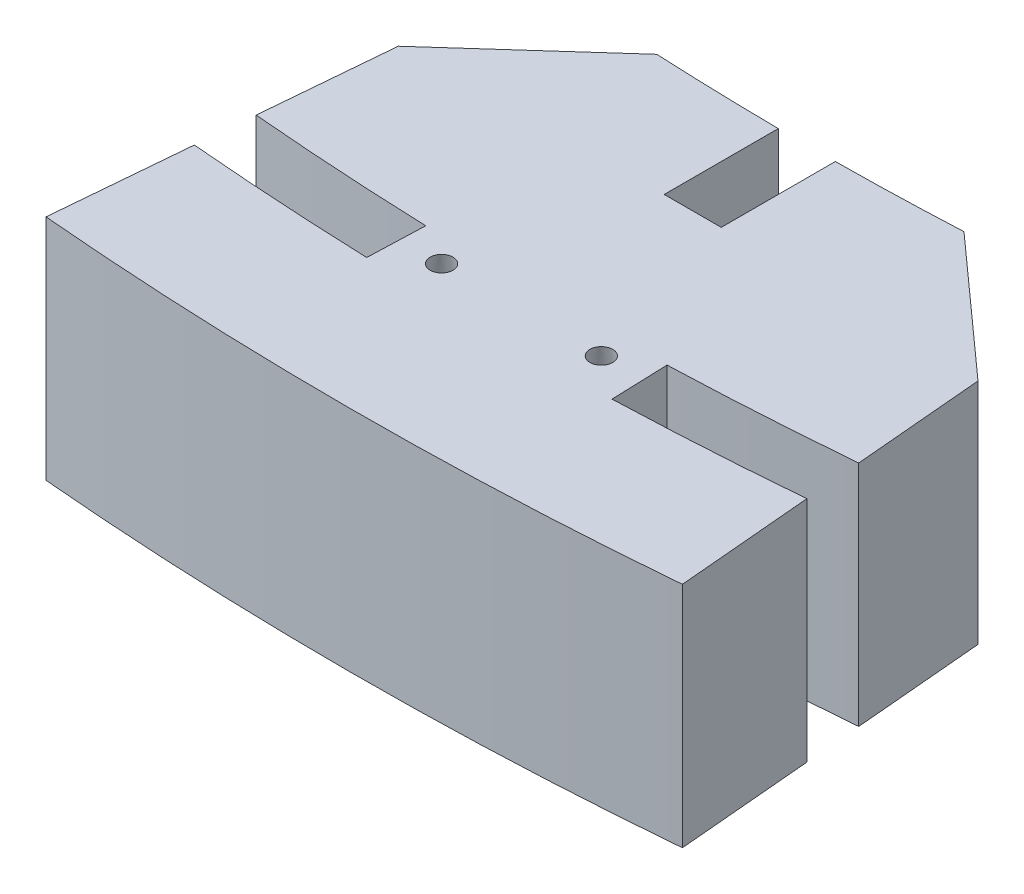
ISO-10303-21;
HEADER;
FILE_DESCRIPTION(('STEP AP214'),'2;1');
FILE_NAME('part.step','',(''),(''),'','','');
FILE_SCHEMA(('AUTOMOTIVE_DESIGN { 1 0 10303 214 1 1 1 1 }'));
ENDSEC;
DATA;
#1=APPLICATION_CONTEXT('core data for automotive mechanical design processes');
#2=APPLICATION_PROTOCOL_DEFINITION('international standard','automotive_design',2000,#1);
#3=PRODUCT_CONTEXT('',#1,'mechanical');
#4=PRODUCT('Part','Part','',(#3));
#5=PRODUCT_RELATED_PRODUCT_CATEGORY('part','',(#4));
#6=PRODUCT_DEFINITION_FORMATION('','',#4);
#7=PRODUCT_DEFINITION_CONTEXT('part definition',#1,'design');
#8=PRODUCT_DEFINITION('design','',#6,#7);
#9=PRODUCT_DEFINITION_SHAPE('','',#8);
#10=(LENGTH_UNIT() NAMED_UNIT(*) SI_UNIT(.MILLI.,.METRE.));
#11=(NAMED_UNIT(*) PLANE_ANGLE_UNIT() SI_UNIT($,.RADIAN.));
#12=(NAMED_UNIT(*) SI_UNIT($,.STERADIAN.) SOLID_ANGLE_UNIT());
#13=UNCERTAINTY_MEASURE_WITH_UNIT(LENGTH_MEASURE(1.E-05),#10,'distance_accuracy_value','');
#14=(GEOMETRIC_REPRESENTATION_CONTEXT(3) GLOBAL_UNCERTAINTY_ASSIGNED_CONTEXT((#13)) GLOBAL_UNIT_ASSIGNED_CONTEXT((#10,
#11,#12)) REPRESENTATION_CONTEXT('',''));
#15=CARTESIAN_POINT('',(0.,0.,0.));
#16=DIRECTION('',(0.,0.,1.));
#17=DIRECTION('',(1.,0.,0.));
#18=AXIS2_PLACEMENT_3D('',#15,#16,#17);
#19=CARTESIAN_POINT('',(53.7452249218411,100.,1539.06187360941));
#20=DIRECTION('',(-0.999390827019096,0.,0.0348994967024942));
#21=DIRECTION('',(0.0348994967024942,0.,0.999390827019096));
#22=AXIS2_PLACEMENT_3D('',#19,#20,#21);
#23=PLANE('',#22);
#24=DIRECTION('',(-0.0348994967024942,0.,-0.999390827019096));
#25=VECTOR('',#24,1.);
#26=CARTESIAN_POINT('',(53.7452249218411,0.,1539.06187360941));
#27=LINE('',#26,#25);
#28=CARTESIAN_POINT('',(53.7452249218411,0.,1539.06187360941));
#29=VERTEX_POINT('',#28);
#30=CARTESIAN_POINT('',(52.8727375042787,0.,1514.07710293393));
#31=VERTEX_POINT('',#30);
#32=EDGE_CURVE('E229',#29,#31,#27,.T.);
#33=ORIENTED_EDGE('',*,*,#32,.T.);
#34=DIRECTION('',(0.,-1.,0.));
#35=VECTOR('',#34,1.);
#36=CARTESIAN_POINT('',(52.8727375042787,100.,1514.07710293393));
#37=LINE('',#36,#35);
#38=CARTESIAN_POINT('',(52.8727375042787,100.,1514.07710293393));
#39=VERTEX_POINT('',#38);
#40=EDGE_CURVE('E251',#39,#31,#37,.T.);
#41=ORIENTED_EDGE('',*,*,#40,.F.);
#42=DIRECTION('',(-0.0348994967024942,0.,-0.999390827019096));
#43=VECTOR('',#42,1.);
#44=CARTESIAN_POINT('',(53.7452249218411,100.,1539.06187360941));
#45=LINE('',#44,#43);
#46=CARTESIAN_POINT('',(53.7452249218411,100.,1539.06187360941));
#47=VERTEX_POINT('',#46);
#48=EDGE_CURVE('E414',#47,#39,#45,.T.);
#49=ORIENTED_EDGE('',*,*,#48,.F.);
#50=DIRECTION('',(0.,-1.,0.));
#51=VECTOR('',#50,1.);
#52=CARTESIAN_POINT('',(53.7452249218411,100.,1539.06187360941));
#53=LINE('',#52,#51);
#54=EDGE_CURVE('E253',#47,#29,#53,.T.);
#55=ORIENTED_EDGE('',*,*,#54,.T.);
#56=EDGE_LOOP('',(#33,#41,#49,#55));
#57=FACE_BOUND('',#56,.T.);
#58=CARTESIAN_POINT('',(53.274081716357,40.,1525.57009744465));
#59=DIRECTION('',(0.999390827019096,0.,-0.034899496702494));
#60=DIRECTION('',(-0.034899496702494,0.,-0.999390827019096));
#61=AXIS2_PLACEMENT_3D('',#58,#59,#60);
#62=CIRCLE('',#61,2.49999999999999);
#63=CARTESIAN_POINT('',(53.1868329746008,40.,1523.0716203771));
#64=VERTEX_POINT('',#63);
#65=EDGE_CURVE('E167',#64,#64,#62,.T.);
#66=ORIENTED_EDGE('',*,*,#65,.F.);
#67=EDGE_LOOP('',(#66));
#68=FACE_BOUND('',#67,.T.);
#69=ADVANCED_FACE('F37',(#57,#68),#23,.F.);
#70=CARTESIAN_POINT('',(-139.449188396242,100.,1593.91151694679));
#71=DIRECTION('',(0.996194698091746,0.,0.0871557427476512));
#72=DIRECTION('',(0.0871557427476512,0.,-0.996194698091746));
#73=AXIS2_PLACEMENT_3D('',#70,#71,#72);
#74=PLANE('',#73);
#75=DIRECTION('',(-0.0871557427476512,0.,0.996194698091746));
#76=VECTOR('',#75,1.);
#77=CARTESIAN_POINT('',(-139.449188396242,100.,1593.91151694679));
#78=LINE('',#77,#76);
#79=CARTESIAN_POINT('',(-127.029495054575,100.,1451.95377246873));
#80=VERTEX_POINT('',#79);
#81=CARTESIAN_POINT('',(-132.040950262692,100.,1509.234967609));
#82=VERTEX_POINT('',#81);
#83=EDGE_CURVE('E196',#80,#82,#78,.T.);
#84=ORIENTED_EDGE('',*,*,#83,.F.);
#85=DIRECTION('',(0.,-1.,0.));
#86=VECTOR('',#85,1.);
#87=CARTESIAN_POINT('',(-127.029495054575,100.001,1451.95377246873));
#88=LINE('',#87,#86);
#89=CARTESIAN_POINT('',(-127.029495054575,0.,1451.95377246873));
#90=VERTEX_POINT('',#89);
#91=EDGE_CURVE('E163',#80,#90,#88,.T.);
#92=ORIENTED_EDGE('',*,*,#91,.T.);
#93=DIRECTION('',(-0.0871557427476512,0.,0.996194698091746));
#94=VECTOR('',#93,1.);
#95=CARTESIAN_POINT('',(-139.449188396242,0.,1593.91151694679));
#96=LINE('',#95,#94);
#97=CARTESIAN_POINT('',(-132.040950262692,0.,1509.234967609));
#98=VERTEX_POINT('',#97);
#99=EDGE_CURVE('E207',#90,#98,#96,.T.);
#100=ORIENTED_EDGE('',*,*,#99,.T.);
#101=DIRECTION('',(0.,-1.,0.));
#102=VECTOR('',#101,1.);
#103=CARTESIAN_POINT('',(-132.040950262692,100.,1509.234967609));
#104=LINE('',#103,#102);
#105=EDGE_CURVE('E259',#82,#98,#104,.T.);
#106=ORIENTED_EDGE('',*,*,#105,.F.);
#107=EDGE_LOOP('',(#84,#92,#100,#106));
#108=FACE_BOUND('',#107,.T.);
#109=ADVANCED_FACE('F328',(#108),#74,.F.);
#110=CARTESIAN_POINT('',(122.018039846722,100.,1394.67257732844));
#111=DIRECTION('',(-0.996194698091746,0.,0.0871557427476584));
#112=DIRECTION('',(0.0871557427476584,0.,0.996194698091746));
#113=AXIS2_PLACEMENT_3D('',#110,#111,#112);
#114=PLANE('',#113);
#115=DIRECTION('',(-0.0871557427476584,0.,-0.996194698091746));
#116=VECTOR('',#115,1.);
#117=CARTESIAN_POINT('',(122.018039846722,0.,1394.67257732844));
#118=LINE('',#117,#116);
#119=CARTESIAN_POINT('',(139.449188396253,0.,1593.91151694679));
#120=VERTEX_POINT('',#119);
#121=CARTESIAN_POINT('',(134.219843831383,0.,1534.13983506129));
#122=VERTEX_POINT('',#121);
#123=EDGE_CURVE('E186',#120,#122,#118,.T.);
#124=ORIENTED_EDGE('',*,*,#123,.T.);
#125=DIRECTION('',(0.,-1.,0.));
#126=VECTOR('',#125,1.);
#127=CARTESIAN_POINT('',(134.219843831383,100.,1534.13983506129));
#128=LINE('',#127,#126);
#129=CARTESIAN_POINT('',(134.219843831383,100.,1534.13983506129));
#130=VERTEX_POINT('',#129);
#131=EDGE_CURVE('E245',#130,#122,#128,.T.);
#132=ORIENTED_EDGE('',*,*,#131,.F.);
#133=DIRECTION('',(-0.0871557427476584,0.,-0.996194698091746));
#134=VECTOR('',#133,1.);
#135=CARTESIAN_POINT('',(122.018039846722,100.,1394.67257732844));
#136=LINE('',#135,#134);
#137=CARTESIAN_POINT('',(139.449188396253,100.,1593.91151694679));
#138=VERTEX_POINT('',#137);
#139=EDGE_CURVE('E201',#138,#130,#136,.T.);
#140=ORIENTED_EDGE('',*,*,#139,.F.);
#141=DIRECTION('',(0.,-1.,0.));
#142=VECTOR('',#141,1.);
#143=CARTESIAN_POINT('',(139.449188396253,100.,1593.91151694679));
#144=LINE('',#143,#142);
#145=EDGE_CURVE('E45',#138,#120,#144,.T.);
#146=ORIENTED_EDGE('',*,*,#145,.T.);
#147=EDGE_LOOP('',(#124,#132,#140,#146));
#148=FACE_BOUND('',#147,.T.);
#149=ADVANCED_FACE('F215',(#148),#114,.F.);
#150=CARTESIAN_POINT('',(0.,100.,0.));
#151=DIRECTION('',(0.,-1.,0.));
#152=DIRECTION('',(0.,0.,-1.));
#153=AXIS2_PLACEMENT_3D('',#150,#151,#152);
#154=CYLINDRICAL_SURFACE('',#153,1400.);
#155=CARTESIAN_POINT('',(0.,0.,0.));
#156=DIRECTION('',(0.,-1.,0.));
#157=DIRECTION('',(0.,0.,1.));
#158=AXIS2_PLACEMENT_3D('',#155,#156,#157);
#159=CIRCLE('',#158,1400.);
#160=CARTESIAN_POINT('',(-12.4999999999998,0.,1399.94419531637));
#161=VERTEX_POINT('',#160);
#162=CARTESIAN_POINT('',(-67.3106473754612,0.,1398.38094836489));
#163=VERTEX_POINT('',#162);
#164=EDGE_CURVE('E176',#161,#163,#159,.T.);
#165=ORIENTED_EDGE('',*,*,#164,.T.);
#166=DIRECTION('',(0.,-1.,0.));
#167=VECTOR('',#166,1.);
#168=CARTESIAN_POINT('',(-67.3106473754612,100.001,1398.38094836489));
#169=LINE('',#168,#167);
#170=CARTESIAN_POINT('',(-67.3106473754614,100.,1398.38094836489));
#171=VERTEX_POINT('',#170);
#172=EDGE_CURVE('E60',#171,#163,#169,.T.);
#173=ORIENTED_EDGE('',*,*,#172,.F.);
#174=CARTESIAN_POINT('',(0.,100.,0.));
#175=DIRECTION('',(0.,-1.,0.));
#176=DIRECTION('',(0.,0.,1.));
#177=AXIS2_PLACEMENT_3D('',#174,#175,#176);
#178=CIRCLE('',#177,1400.);
#179=CARTESIAN_POINT('',(-12.4999999999998,100.,1399.94419531637));
#180=VERTEX_POINT('',#179);
#181=EDGE_CURVE('E174',#180,#171,#178,.T.);
#182=ORIENTED_EDGE('',*,*,#181,.F.);
#183=DIRECTION('',(0.,1.,0.));
#184=VECTOR('',#183,1.);
#185=CARTESIAN_POINT('',(-12.4999999999998,0.,1399.94419531637));
#186=LINE('',#185,#184);
#187=EDGE_CURVE('E292',#161,#180,#186,.T.);
#188=ORIENTED_EDGE('',*,*,#187,.F.);
#189=EDGE_LOOP('',(#165,#173,#182,#188));
#190=FACE_BOUND('',#189,.T.);
#191=ADVANCED_FACE('F172',(#190),#154,.F.);
#192=CARTESIAN_POINT('',(67.3106473754616,100.,1398.38094836489));
#193=VERTEX_POINT('',#192);
#194=CARTESIAN_POINT('',(12.5000000000002,100.,1399.94419531637));
#195=VERTEX_POINT('',#194);
#196=EDGE_CURVE('E185',#193,#195,#178,.T.);
#197=ORIENTED_EDGE('',*,*,#196,.F.);
#198=DIRECTION('',(0.,-1.,0.));
#199=VECTOR('',#198,1.);
#200=CARTESIAN_POINT('',(67.3106473754616,100.001,1398.38094836489));
#201=LINE('',#200,#199);
#202=CARTESIAN_POINT('',(67.3106473754616,0.,1398.38094836489));
#203=VERTEX_POINT('',#202);
#204=EDGE_CURVE('E309',#193,#203,#201,.T.);
#205=ORIENTED_EDGE('',*,*,#204,.T.);
#206=CARTESIAN_POINT('',(12.5000000000002,0.,1399.94419531637));
#207=VERTEX_POINT('',#206);
#208=EDGE_CURVE('E204',#203,#207,#159,.T.);
#209=ORIENTED_EDGE('',*,*,#208,.T.);
#210=DIRECTION('',(0.,1.,0.));
#211=VECTOR('',#210,1.);
#212=CARTESIAN_POINT('',(12.5000000000002,0.,1399.94419531637));
#213=LINE('',#212,#211);
#214=EDGE_CURVE('E293',#207,#195,#213,.T.);
#215=ORIENTED_EDGE('',*,*,#214,.T.);
#216=EDGE_LOOP('',(#197,#205,#209,#215));
#217=FACE_BOUND('',#216,.T.);
#218=ADVANCED_FACE('F39',(#217),#154,.F.);
#219=CARTESIAN_POINT('',(-134.219843831383,100.,1534.13983506129));
#220=VERTEX_POINT('',#219);
#221=CARTESIAN_POINT('',(-139.449188396242,100.,1593.91151694679));
#222=VERTEX_POINT('',#221);
#223=EDGE_CURVE('E188',#220,#222,#78,.T.);
#224=ORIENTED_EDGE('',*,*,#223,.F.);
#225=DIRECTION('',(0.,-1.,0.));
#226=VECTOR('',#225,1.);
#227=CARTESIAN_POINT('',(-134.219843831383,100.,1534.13983506129));
#228=LINE('',#227,#226);
#229=CARTESIAN_POINT('',(-134.219843831383,0.,1534.13983506129));
#230=VERTEX_POINT('',#229);
#231=EDGE_CURVE('E385',#220,#230,#228,.T.);
#232=ORIENTED_EDGE('',*,*,#231,.T.);
#233=CARTESIAN_POINT('',(-139.449188396242,0.,1593.91151694679));
#234=VERTEX_POINT('',#233);
#235=EDGE_CURVE('E206',#230,#234,#96,.T.);
#236=ORIENTED_EDGE('',*,*,#235,.T.);
#237=DIRECTION('',(0.,-1.,0.));
#238=VECTOR('',#237,1.);
#239=CARTESIAN_POINT('',(-139.449188396242,100.,1593.91151694679));
#240=LINE('',#239,#238);
#241=EDGE_CURVE('E11',#222,#234,#240,.T.);
#242=ORIENTED_EDGE('',*,*,#241,.F.);
#243=EDGE_LOOP('',(#224,#232,#236,#242));
#244=FACE_BOUND('',#243,.T.);
#245=ADVANCED_FACE('F335',(#244),#74,.F.);
#246=CARTESIAN_POINT('',(0.,100.,0.));
#247=DIRECTION('',(0.,-1.,0.));
#248=DIRECTION('',(0.,0.,-1.));
#249=AXIS2_PLACEMENT_3D('',#246,#247,#248);
#250=CYLINDRICAL_SURFACE('',#249,1600.);
#251=CARTESIAN_POINT('',(0.,0.,0.));
#252=DIRECTION('',(0.,1.,0.));
#253=DIRECTION('',(0.,0.,1.));
#254=AXIS2_PLACEMENT_3D('',#251,#252,#253);
#255=CIRCLE('',#254,1600.);
#256=EDGE_CURVE('E209',#234,#120,#255,.T.);
#257=ORIENTED_EDGE('',*,*,#256,.T.);
#258=ORIENTED_EDGE('',*,*,#145,.F.);
#259=CARTESIAN_POINT('',(0.,100.,0.));
#260=DIRECTION('',(0.,1.,0.));
#261=DIRECTION('',(0.,0.,1.));
#262=AXIS2_PLACEMENT_3D('',#259,#260,#261);
#263=CIRCLE('',#262,1600.);
#264=EDGE_CURVE('E198',#222,#138,#263,.T.);
#265=ORIENTED_EDGE('',*,*,#264,.F.);
#266=ORIENTED_EDGE('',*,*,#241,.T.);
#267=EDGE_LOOP('',(#257,#258,#265,#266));
#268=FACE_BOUND('',#267,.T.);
#269=ADVANCED_FACE('F372',(#268),#250,.T.);
#270=CARTESIAN_POINT('',(132.040950262692,0.,1509.234967609));
#271=VERTEX_POINT('',#270);
#272=CARTESIAN_POINT('',(127.029495054725,0.,1451.95377246887));
#273=VERTEX_POINT('',#272);
#274=EDGE_CURVE('E190',#271,#273,#118,.T.);
#275=ORIENTED_EDGE('',*,*,#274,.T.);
#276=DIRECTION('',(0.,-1.,0.));
#277=VECTOR('',#276,1.);
#278=CARTESIAN_POINT('',(127.029495054575,100.001,1451.95377246873));
#279=LINE('',#278,#277);
#280=CARTESIAN_POINT('',(127.029495054725,100.,1451.95377246887));
#281=VERTEX_POINT('',#280);
#282=EDGE_CURVE('E52',#281,#273,#279,.T.);
#283=ORIENTED_EDGE('',*,*,#282,.F.);
#284=CARTESIAN_POINT('',(132.040950262692,100.,1509.234967609));
#285=VERTEX_POINT('',#284);
#286=EDGE_CURVE('E200',#285,#281,#136,.T.);
#287=ORIENTED_EDGE('',*,*,#286,.F.);
#288=DIRECTION('',(0.,-1.,0.));
#289=VECTOR('',#288,1.);
#290=CARTESIAN_POINT('',(132.040950262692,100.,1509.234967609));
#291=LINE('',#290,#289);
#292=EDGE_CURVE('E248',#285,#271,#291,.T.);
#293=ORIENTED_EDGE('',*,*,#292,.T.);
#294=EDGE_LOOP('',(#275,#283,#287,#293));
#295=FACE_BOUND('',#294,.T.);
#296=ADVANCED_FACE('F367',(#295),#114,.F.);
#297=CARTESIAN_POINT('',(0.,100.,0.));
#298=DIRECTION('',(0.,1.,0.));
#299=DIRECTION('',(0.,0.,1.));
#300=AXIS2_PLACEMENT_3D('',#297,#298,#299);
#301=PLANE('',#300);
#302=DIRECTION('',(-0.744372469430462,0.,0.667764649224558));
#303=VECTOR('',#302,1.);
#304=CARTESIAN_POINT('',(-127.029495054575,100.,1451.95377246873));
#305=LINE('',#304,#303);
#306=EDGE_CURVE('E160',#171,#80,#305,.T.);
#307=ORIENTED_EDGE('',*,*,#306,.T.);
#308=ORIENTED_EDGE('',*,*,#83,.T.);
#309=CARTESIAN_POINT('',(0.,100.,0.));
#310=DIRECTION('',(0.,1.,0.));
#311=DIRECTION('',(0.,0.,-1.));
#312=AXIS2_PLACEMENT_3D('',#309,#310,#311);
#313=CIRCLE('',#312,1515.);
#314=CARTESIAN_POINT('',(-52.8727375042787,100.,1514.07710293393));
#315=VERTEX_POINT('',#314);
#316=EDGE_CURVE('E399',#82,#315,#313,.T.);
#317=ORIENTED_EDGE('',*,*,#316,.T.);
#318=DIRECTION('',(-0.0348994967024942,0.,0.999390827019096));
#319=VECTOR('',#318,1.);
#320=CARTESIAN_POINT('',(-53.7452249218411,100.,1539.06187360941));
#321=LINE('',#320,#319);
#322=CARTESIAN_POINT('',(-53.7452249218411,100.,1539.06187360941));
#323=VERTEX_POINT('',#322);
#324=EDGE_CURVE('E392',#315,#323,#321,.T.);
#325=ORIENTED_EDGE('',*,*,#324,.T.);
#326=CARTESIAN_POINT('',(0.,100.,0.));
#327=DIRECTION('',(0.,-1.,0.));
#328=DIRECTION('',(0.,0.,-1.));
#329=AXIS2_PLACEMENT_3D('',#326,#327,#328);
#330=CIRCLE('',#329,1540.);
#331=EDGE_CURVE('E389',#323,#220,#330,.T.);
#332=ORIENTED_EDGE('',*,*,#331,.T.);
#333=ORIENTED_EDGE('',*,*,#223,.T.);
#334=ORIENTED_EDGE('',*,*,#264,.T.);
#335=ORIENTED_EDGE('',*,*,#139,.T.);
#336=CARTESIAN_POINT('',(0.,100.,0.));
#337=DIRECTION('',(0.,-1.,0.));
#338=DIRECTION('',(0.,0.,1.));
#339=AXIS2_PLACEMENT_3D('',#336,#337,#338);
#340=CIRCLE('',#339,1540.);
#341=EDGE_CURVE('E244',#130,#47,#340,.T.);
#342=ORIENTED_EDGE('',*,*,#341,.T.);
#343=ORIENTED_EDGE('',*,*,#48,.T.);
#344=CARTESIAN_POINT('',(0.,100.,0.));
#345=DIRECTION('',(0.,1.,0.));
#346=DIRECTION('',(0.,0.,1.));
#347=AXIS2_PLACEMENT_3D('',#344,#345,#346);
#348=CIRCLE('',#347,1515.);
#349=EDGE_CURVE('E240',#39,#285,#348,.T.);
#350=ORIENTED_EDGE('',*,*,#349,.T.);
#351=ORIENTED_EDGE('',*,*,#286,.T.);
#352=DIRECTION('',(-0.744372469430461,0.,-0.667764649224559));
#353=VECTOR('',#352,1.);
#354=CARTESIAN_POINT('',(127.029495054575,100.,1451.95377246873));
#355=LINE('',#354,#353);
#356=EDGE_CURVE('E307',#281,#193,#355,.T.);
#357=ORIENTED_EDGE('',*,*,#356,.T.);
#358=ORIENTED_EDGE('',*,*,#196,.T.);
#359=DIRECTION('',(0.,0.,-1.));
#360=VECTOR('',#359,1.);
#361=CARTESIAN_POINT('',(12.5000000000002,100.,1449.94419531637));
#362=LINE('',#361,#360);
#363=CARTESIAN_POINT('',(12.5000000000002,100.,1449.94419531637));
#364=VERTEX_POINT('',#363);
#365=EDGE_CURVE('E286',#364,#195,#362,.T.);
#366=ORIENTED_EDGE('',*,*,#365,.F.);
#367=DIRECTION('',(1.,0.,0.));
#368=VECTOR('',#367,1.);
#369=CARTESIAN_POINT('',(1.78676518025611E-13,100.,1449.94419531637));
#370=LINE('',#369,#368);
#371=CARTESIAN_POINT('',(-12.4999999999998,100.,1449.94419531637));
#372=VERTEX_POINT('',#371);
#373=EDGE_CURVE('E274',#372,#364,#370,.T.);
#374=ORIENTED_EDGE('',*,*,#373,.F.);
#375=DIRECTION('',(0.,0.,1.));
#376=VECTOR('',#375,1.);
#377=CARTESIAN_POINT('',(-12.4999999999998,100.,1449.94419531637));
#378=LINE('',#377,#376);
#379=EDGE_CURVE('E184',#180,#372,#378,.T.);
#380=ORIENTED_EDGE('',*,*,#379,.F.);
#381=ORIENTED_EDGE('',*,*,#181,.T.);
#382=EDGE_LOOP('',(#307,#308,#317,#325,#332,#333,#334,#335,#342,#343,#350,#351,#357,#358,#366,
#374,#380,#381));
#383=FACE_BOUND('',#382,.T.);
#384=CARTESIAN_POINT('',(35.0000000000003,100.,1525.));
#385=DIRECTION('',(0.,1.,0.));
#386=DIRECTION('',(0.,0.,-1.));
#387=AXIS2_PLACEMENT_3D('',#384,#385,#386);
#388=CIRCLE('',#387,4.99999999999989);
#389=CARTESIAN_POINT('',(35.0000000000003,100.,1520.));
#390=VERTEX_POINT('',#389);
#391=EDGE_CURVE('E262',#390,#390,#388,.T.);
#392=ORIENTED_EDGE('',*,*,#391,.F.);
#393=EDGE_LOOP('',(#392));
#394=FACE_BOUND('',#393,.T.);
#395=CARTESIAN_POINT('',(-35.0000000000006,100.,1525.));
#396=DIRECTION('',(0.,-1.,0.));
#397=DIRECTION('',(0.,0.,-1.));
#398=AXIS2_PLACEMENT_3D('',#395,#396,#397);
#399=CIRCLE('',#398,4.99999999999989);
#400=CARTESIAN_POINT('',(-35.0000000000006,100.,1520.));
#401=VERTEX_POINT('',#400);
#402=EDGE_CURVE('E271',#401,#401,#399,.T.);
#403=ORIENTED_EDGE('',*,*,#402,.T.);
#404=EDGE_LOOP('',(#403));
#405=FACE_BOUND('',#404,.T.);
#406=ADVANCED_FACE('F180',(#383,#394,#405),#301,.T.);
#407=CARTESIAN_POINT('',(0.,0.,0.));
#408=DIRECTION('',(0.,1.,0.));
#409=DIRECTION('',(0.,0.,1.));
#410=AXIS2_PLACEMENT_3D('',#407,#408,#409);
#411=PLANE('',#410);
#412=CARTESIAN_POINT('',(35.0000000000003,0.,1525.));
#413=DIRECTION('',(0.,1.,0.));
#414=DIRECTION('',(0.,0.,-1.));
#415=AXIS2_PLACEMENT_3D('',#412,#413,#414);
#416=CIRCLE('',#415,13.6824088833463);
#417=CARTESIAN_POINT('',(35.0000000000003,0.,1511.31759111665));
#418=VERTEX_POINT('',#417);
#419=EDGE_CURVE('E255',#418,#418,#416,.T.);
#420=ORIENTED_EDGE('',*,*,#419,.T.);
#421=EDGE_LOOP('',(#420));
#422=FACE_BOUND('',#421,.T.);
#423=CARTESIAN_POINT('',(-35.0000000000006,0.,1525.));
#424=DIRECTION('',(0.,-1.,0.));
#425=DIRECTION('',(0.,0.,-1.));
#426=AXIS2_PLACEMENT_3D('',#423,#424,#425);
#427=CIRCLE('',#426,13.6824088833463);
#428=CARTESIAN_POINT('',(-35.0000000000006,0.,1511.31759111665));
#429=VERTEX_POINT('',#428);
#430=EDGE_CURVE('E265',#429,#429,#427,.T.);
#431=ORIENTED_EDGE('',*,*,#430,.F.);
#432=EDGE_LOOP('',(#431));
#433=FACE_BOUND('',#432,.T.);
#434=ORIENTED_EDGE('',*,*,#99,.F.);
#435=DIRECTION('',(-0.744372469430462,0.,0.667764649224558));
#436=VECTOR('',#435,1.);
#437=CARTESIAN_POINT('',(-127.029495054575,0.,1451.95377246873));
#438=LINE('',#437,#436);
#439=EDGE_CURVE('E177',#163,#90,#438,.T.);
#440=ORIENTED_EDGE('',*,*,#439,.F.);
#441=ORIENTED_EDGE('',*,*,#164,.F.);
#442=DIRECTION('',(0.,0.,1.));
#443=VECTOR('',#442,1.);
#444=CARTESIAN_POINT('',(-12.4999999999998,0.,1449.94419531637));
#445=LINE('',#444,#443);
#446=CARTESIAN_POINT('',(-12.4999999999998,0.,1449.94419531637));
#447=VERTEX_POINT('',#446);
#448=EDGE_CURVE('E281',#161,#447,#445,.T.);
#449=ORIENTED_EDGE('',*,*,#448,.T.);
#450=DIRECTION('',(1.,0.,0.));
#451=VECTOR('',#450,1.);
#452=CARTESIAN_POINT('',(1.78676518025611E-13,0.,1449.94419531637));
#453=LINE('',#452,#451);
#454=CARTESIAN_POINT('',(12.5000000000002,0.,1449.94419531637));
#455=VERTEX_POINT('',#454);
#456=EDGE_CURVE('E275',#447,#455,#453,.T.);
#457=ORIENTED_EDGE('',*,*,#456,.T.);
#458=DIRECTION('',(0.,0.,-1.));
#459=VECTOR('',#458,1.);
#460=CARTESIAN_POINT('',(12.5000000000002,0.,1449.94419531637));
#461=LINE('',#460,#459);
#462=EDGE_CURVE('E278',#455,#207,#461,.T.);
#463=ORIENTED_EDGE('',*,*,#462,.T.);
#464=ORIENTED_EDGE('',*,*,#208,.F.);
#465=DIRECTION('',(-0.744372469430461,0.,-0.667764649224559));
#466=VECTOR('',#465,1.);
#467=CARTESIAN_POINT('',(127.029495054575,0.,1451.95377246873));
#468=LINE('',#467,#466);
#469=EDGE_CURVE('E313',#273,#203,#468,.T.);
#470=ORIENTED_EDGE('',*,*,#469,.F.);
#471=ORIENTED_EDGE('',*,*,#274,.F.);
#472=CARTESIAN_POINT('',(0.,0.,0.));
#473=DIRECTION('',(0.,1.,0.));
#474=DIRECTION('',(0.,0.,1.));
#475=AXIS2_PLACEMENT_3D('',#472,#473,#474);
#476=CIRCLE('',#475,1515.);
#477=EDGE_CURVE('E234',#31,#271,#476,.T.);
#478=ORIENTED_EDGE('',*,*,#477,.F.);
#479=ORIENTED_EDGE('',*,*,#32,.F.);
#480=CARTESIAN_POINT('',(0.,0.,0.));
#481=DIRECTION('',(0.,-1.,0.));
#482=DIRECTION('',(0.,0.,1.));
#483=AXIS2_PLACEMENT_3D('',#480,#481,#482);
#484=CIRCLE('',#483,1540.);
#485=EDGE_CURVE('E226',#122,#29,#484,.T.);
#486=ORIENTED_EDGE('',*,*,#485,.F.);
#487=ORIENTED_EDGE('',*,*,#123,.F.);
#488=ORIENTED_EDGE('',*,*,#256,.F.);
#489=ORIENTED_EDGE('',*,*,#235,.F.);
#490=CARTESIAN_POINT('',(0.,0.,0.));
#491=DIRECTION('',(0.,-1.,0.));
#492=DIRECTION('',(0.,0.,-1.));
#493=AXIS2_PLACEMENT_3D('',#490,#491,#492);
#494=CIRCLE('',#493,1540.);
#495=CARTESIAN_POINT('',(-53.7452249218411,0.,1539.06187360941));
#496=VERTEX_POINT('',#495);
#497=EDGE_CURVE('E407',#496,#230,#494,.T.);
#498=ORIENTED_EDGE('',*,*,#497,.F.);
#499=DIRECTION('',(-0.0348994967024942,0.,0.999390827019096));
#500=VECTOR('',#499,1.);
#501=CARTESIAN_POINT('',(-53.7452249218411,0.,1539.06187360941));
#502=LINE('',#501,#500);
#503=CARTESIAN_POINT('',(-52.8727375042787,0.,1514.07710293393));
#504=VERTEX_POINT('',#503);
#505=EDGE_CURVE('E404',#504,#496,#502,.T.);
#506=ORIENTED_EDGE('',*,*,#505,.F.);
#507=CARTESIAN_POINT('',(0.,0.,0.));
#508=DIRECTION('',(0.,1.,0.));
#509=DIRECTION('',(0.,0.,-1.));
#510=AXIS2_PLACEMENT_3D('',#507,#508,#509);
#511=CIRCLE('',#510,1515.);
#512=EDGE_CURVE('E247',#98,#504,#511,.T.);
#513=ORIENTED_EDGE('',*,*,#512,.F.);
#514=EDGE_LOOP('',(#434,#440,#441,#449,#457,#463,#464,#470,#471,#478,#479,#486,#487,#488,#489,
#498,#506,#513));
#515=FACE_BOUND('',#514,.T.);
#516=ADVANCED_FACE('F223',(#422,#433,#515),#411,.F.);
#517=CARTESIAN_POINT('',(-12.4999999999998,0.,1449.94419531637));
#518=DIRECTION('',(-1.,0.,0.));
#519=DIRECTION('',(0.,0.,1.));
#520=AXIS2_PLACEMENT_3D('',#517,#518,#519);
#521=PLANE('',#520);
#522=ORIENTED_EDGE('',*,*,#379,.T.);
#523=DIRECTION('',(0.,1.,0.));
#524=VECTOR('',#523,1.);
#525=CARTESIAN_POINT('',(-12.4999999999998,0.,1449.94419531637));
#526=LINE('',#525,#524);
#527=EDGE_CURVE('E290',#447,#372,#526,.T.);
#528=ORIENTED_EDGE('',*,*,#527,.F.);
#529=ORIENTED_EDGE('',*,*,#448,.F.);
#530=ORIENTED_EDGE('',*,*,#187,.T.);
#531=EDGE_LOOP('',(#522,#528,#529,#530));
#532=FACE_BOUND('',#531,.T.);
#533=ADVANCED_FACE('F316',(#532),#521,.F.);
#534=CARTESIAN_POINT('',(12.5000000000002,0.,1449.94419531637));
#535=DIRECTION('',(1.,0.,0.));
#536=DIRECTION('',(0.,0.,-1.));
#537=AXIS2_PLACEMENT_3D('',#534,#535,#536);
#538=PLANE('',#537);
#539=ORIENTED_EDGE('',*,*,#365,.T.);
#540=ORIENTED_EDGE('',*,*,#214,.F.);
#541=ORIENTED_EDGE('',*,*,#462,.F.);
#542=DIRECTION('',(0.,1.,0.));
#543=VECTOR('',#542,1.);
#544=CARTESIAN_POINT('',(12.5000000000002,0.,1449.94419531637));
#545=LINE('',#544,#543);
#546=EDGE_CURVE('E194',#455,#364,#545,.T.);
#547=ORIENTED_EDGE('',*,*,#546,.T.);
#548=EDGE_LOOP('',(#539,#540,#541,#547));
#549=FACE_BOUND('',#548,.T.);
#550=ADVANCED_FACE('F300',(#549),#538,.F.);
#551=CARTESIAN_POINT('',(1.78676518025611E-13,0.,1449.94419531637));
#552=DIRECTION('',(0.,0.,1.));
#553=DIRECTION('',(1.,0.,0.));
#554=AXIS2_PLACEMENT_3D('',#551,#552,#553);
#555=PLANE('',#554);
#556=ORIENTED_EDGE('',*,*,#373,.T.);
#557=ORIENTED_EDGE('',*,*,#546,.F.);
#558=ORIENTED_EDGE('',*,*,#456,.F.);
#559=ORIENTED_EDGE('',*,*,#527,.T.);
#560=EDGE_LOOP('',(#556,#557,#558,#559));
#561=FACE_BOUND('',#560,.T.);
#562=ADVANCED_FACE('F304',(#561),#555,.F.);
#563=CARTESIAN_POINT('',(-35.0000000000006,100.,1525.));
#564=DIRECTION('',(0.,-1.,0.));
#565=DIRECTION('',(0.,0.,-1.));
#566=AXIS2_PLACEMENT_3D('',#563,#564,#565);
#567=CONICAL_SURFACE('',#566,4.99999999999989,0.17453292519943);
#568=CARTESIAN_POINT('',(-35.0000000000006,50.7596123493896,1525.));
#569=DIRECTION('',(0.,-1.,0.));
#570=DIRECTION('',(0.,0.,-1.));
#571=AXIS2_PLACEMENT_3D('',#568,#569,#570);
#572=CIRCLE('',#571,13.6824088833463);
#573=CARTESIAN_POINT('',(-35.0000000000006,50.7596123493896,1511.31759111665));
#574=VERTEX_POINT('',#573);
#575=EDGE_CURVE('E268',#574,#574,#572,.T.);
#576=ORIENTED_EDGE('',*,*,#575,.T.);
#577=EDGE_LOOP('',(#576));
#578=FACE_BOUND('',#577,.T.);
#579=ORIENTED_EDGE('',*,*,#402,.F.);
#580=EDGE_LOOP('',(#579));
#581=FACE_BOUND('',#580,.T.);
#582=ADVANCED_FACE('F354',(#578,#581),#567,.F.);
#583=CARTESIAN_POINT('',(-35.0000000000006,0.,1525.));
#584=DIRECTION('',(0.,-1.,0.));
#585=DIRECTION('',(0.,0.,-1.));
#586=AXIS2_PLACEMENT_3D('',#583,#584,#585);
#587=CYLINDRICAL_SURFACE('',#586,13.6824088833463);
#588=CARTESIAN_POINT('',(-48.2918912318321,40.,1528.24560323087));
#589=CARTESIAN_POINT('',(-48.291894282943,39.86272158427,1528.24559749315));
#590=CARTESIAN_POINT('',(-48.2947043962908,39.7253725789473,1528.23414835105));
#591=CARTESIAN_POINT('',(-48.3056684425017,39.4545954892515,1528.18873388377));
#592=CARTESIAN_POINT('',(-48.3138270908823,39.3211709734515,1528.15474868946));
#593=CARTESIAN_POINT('',(-48.3346601438985,39.0622519186243,1528.06549081963));
#594=CARTESIAN_POINT('',(-48.3473279042488,38.9367460299543,1528.01024945594));
#595=CARTESIAN_POINT('',(-48.3759864604593,38.6967533709442,1527.88022767007));
#596=CARTESIAN_POINT('',(-48.3919771575073,38.5822662730931,1527.80544782887));
#597=CARTESIAN_POINT('',(-48.4262379943164,38.3647725485758,1527.63666481528));
#598=CARTESIAN_POINT('',(-48.4445500991362,38.2620692808152,1527.54227939712));
#599=CARTESIAN_POINT('',(-48.4815892461397,38.0736468751745,1527.3379123372));
#600=CARTESIAN_POINT('',(-48.500316354895,37.9879304844416,1527.22792817772));
#601=CARTESIAN_POINT('',(-48.537132069379,37.8337163942807,1526.99221898631));
#602=CARTESIAN_POINT('',(-48.5551918122686,37.7657189673849,1526.86616152724));
#603=CARTESIAN_POINT('',(-48.5886970108674,37.651888289787,1526.60407635578));
#604=CARTESIAN_POINT('',(-48.6041425176699,37.6060546058787,1526.46804883832));
#605=CARTESIAN_POINT('',(-48.6312266741696,37.5382141329587,1526.19050659124));
#606=CARTESIAN_POINT('',(-48.6428834862172,37.5160924625759,1526.04902179052));
#607=CARTESIAN_POINT('',(-48.6618043705633,37.4961645992386,1525.76406189532));
#608=CARTESIAN_POINT('',(-48.6690690713662,37.4983549264061,1525.62058708863));
#609=CARTESIAN_POINT('',(-48.678917008389,37.526860114271,1525.33905754305));
#610=CARTESIAN_POINT('',(-48.6815987260525,37.5526486961999,1525.20095280842));
#611=CARTESIAN_POINT('',(-48.6829009463372,37.6269739667832,1524.93099068895));
#612=CARTESIAN_POINT('',(-48.6815216622104,37.6755094608352,1524.79913297644));
#613=CARTESIAN_POINT('',(-48.6754769662855,37.7933720382057,1524.54674275583));
#614=CARTESIAN_POINT('',(-48.6708440721788,37.8624895135159,1524.42611144676));
#615=CARTESIAN_POINT('',(-48.6593658792875,38.0197355595456,1524.19807046086));
#616=CARTESIAN_POINT('',(-48.6525204845328,38.1078649548781,1524.09066135783));
#617=CARTESIAN_POINT('',(-48.6377820408137,38.3013871624513,1523.89126026486));
#618=CARTESIAN_POINT('',(-48.6298816863957,38.4069016783348,1523.79938694471));
#619=CARTESIAN_POINT('',(-48.6143548466789,38.6317938474378,1523.63452125053));
#620=CARTESIAN_POINT('',(-48.6067283725008,38.7511720627461,1523.56152964243));
#621=CARTESIAN_POINT('',(-48.5928697601904,39.0014224218737,1523.43595252427));
#622=CARTESIAN_POINT('',(-48.5866484706021,39.1323738108543,1523.38352362465));
#623=CARTESIAN_POINT('',(-48.5766183987,39.4012937901772,1523.30133166926));
#624=CARTESIAN_POINT('',(-48.5728095616189,39.5392622211423,1523.27156809894));
#625=CARTESIAN_POINT('',(-48.568180677034,39.8179768792417,1523.2355963418));
#626=CARTESIAN_POINT('',(-48.5673540505257,39.9587163022771,1523.22933630299));
#627=CARTESIAN_POINT('',(-48.56879434634,40.2392462974367,1523.24040851811));
#628=CARTESIAN_POINT('',(-48.5710612313168,40.3790368809951,1523.25774048723));
#629=CARTESIAN_POINT('',(-48.5783402235002,40.6532987001583,1523.31541663366));
#630=CARTESIAN_POINT('',(-48.5833446180124,40.7877837476304,1523.35569617136));
#631=CARTESIAN_POINT('',(-48.5953469672619,41.0480754453295,1523.45808739846));
#632=CARTESIAN_POINT('',(-48.6023449933821,41.1738817846113,1523.52019986962));
#633=CARTESIAN_POINT('',(-48.6172998551136,41.4137454536733,1523.6648071202));
#634=CARTESIAN_POINT('',(-48.6252600964117,41.5277582337927,1523.74737545138));
#635=CARTESIAN_POINT('',(-48.6408547655624,41.7403093084432,1523.93050660352));
#636=CARTESIAN_POINT('',(-48.6484891905643,41.8388474676051,1524.03106958187));
#637=CARTESIAN_POINT('',(-48.6621300934075,42.0177269932749,1524.2474991242));
#638=CARTESIAN_POINT('',(-48.6681352126766,42.0980531648745,1524.36337834041));
#639=CARTESIAN_POINT('',(-48.6773090650522,42.2380778630831,1524.60709328663));
#640=CARTESIAN_POINT('',(-48.6804780105105,42.2977779338178,1524.73492812071));
#641=CARTESIAN_POINT('',(-48.6830334962535,42.3944061092876,1524.99769387491));
#642=CARTESIAN_POINT('',(-48.6824529590236,42.4315293005424,1525.13255274394));
#643=CARTESIAN_POINT('',(-48.6770553967492,42.4828250930109,1525.40647780924));
#644=CARTESIAN_POINT('',(-48.6722385626536,42.4969987285833,1525.54554381561));
#645=CARTESIAN_POINT('',(-48.658329153054,42.5021301842722,1525.82314907788));
#646=CARTESIAN_POINT('',(-48.6492590395581,42.4932088654554,1525.96168729165));
#647=CARTESIAN_POINT('',(-48.6272376249151,42.4528598088735,1526.23512428866));
#648=CARTESIAN_POINT('',(-48.6142860409729,42.4214304309901,1526.37002280595));
#649=CARTESIAN_POINT('',(-48.5851129443098,42.3365609631797,1526.6342989973));
#650=CARTESIAN_POINT('',(-48.5688508475236,42.2828381389249,1526.76358128915));
#651=CARTESIAN_POINT('',(-48.5343474412736,42.1549524849291,1527.01132187936));
#652=CARTESIAN_POINT('',(-48.5161058825496,42.0807870791767,1527.12977881109));
#653=CARTESIAN_POINT('',(-48.4786805286392,41.9122159130116,1527.35516983929));
#654=CARTESIAN_POINT('',(-48.4594849508763,41.8174138157717,1527.46180585644));
#655=CARTESIAN_POINT('',(-48.4221887106805,41.6110179727402,1527.65765432693));
#656=CARTESIAN_POINT('',(-48.4040882893536,41.4994205480661,1527.74686295307));
#657=CARTESIAN_POINT('',(-48.3706492205736,41.2622584675812,1527.90527670663));
#658=CARTESIAN_POINT('',(-48.3553137788838,41.1366778687479,1527.97445867035));
#659=CARTESIAN_POINT('',(-48.3289772363201,40.8752160623595,1528.09034671312));
#660=CARTESIAN_POINT('',(-48.3179711823451,40.7393468392205,1528.13707849027));
#661=CARTESIAN_POINT('',(-48.3038717048227,40.5024110959542,1528.19623523646));
#662=CARTESIAN_POINT('',(-48.2994020614451,40.4028952772667,1528.21471291146));
#663=CARTESIAN_POINT('',(-48.293410776131,40.2022656928988,1528.23939870928));
#664=CARTESIAN_POINT('',(-48.2918889836564,40.1011520090827,1528.24560745864));
#665=CARTESIAN_POINT('',(-48.2918912318321,40.,1528.24560323087));
#666=B_SPLINE_CURVE_WITH_KNOTS('',3,(#588,#589,#590,#591,#592,#593,#594,#595,#596,#597,#598,
#599,#600,#601,#602,#603,#604,#605,#606,#607,#608,#609,#610,#611,#612,#613,#614,#615,#616,#617,
#618,#619,#620,#621,#622,#623,#624,#625,#626,#627,#628,#629,#630,#631,#632,#633,#634,#635,#636,
#637,#638,#639,#640,#641,#642,#643,#644,#645,#646,#647,#648,#649,#650,#651,#652,#653,#654,#655,
#656,#657,#658,#659,#660,#661,#662,#663,#664,#665),.UNSPECIFIED.,.T.,.F.,(4,2,2,2,2,2,2,2,2,2,2,
2,2,2,2,2,2,2,2,2,2,2,2,2,2,2,2,2,2,2,2,2,2,2,2,2,2,2,4),(0.,0.41145989552881,0.823283042005614,
1.23450185227361,1.64570843612874,2.06584624757879,2.48605194909739,2.91707903336567,
3.34809769256192,3.77701855504651,4.2058780250847,4.62540034610069,5.0449006374777,
5.46026688698,5.87565115598203,6.29407753615953,6.71252088691258,7.13409203181944,
7.55565360591541,7.97628460948256,8.39691053512864,8.81635744233667,9.23581936991049,
9.65681199314826,10.0778082989522,10.4991545748332,10.9204693007502,11.338089715482,
11.7556913071341,12.1711119192723,12.5865628053804,13.0074519332198,13.4283941224223,
13.858274426619,14.2882490300838,14.7187189916899,15.1486950252582,15.4518899626759,
15.7550694164042),.UNSPECIFIED.);
#667=CARTESIAN_POINT('',(-48.2918912318321,40.,1528.24560323087));
#668=VERTEX_POINT('',#667);
#669=EDGE_CURVE('E232',#668,#668,#666,.T.);
#670=ORIENTED_EDGE('',*,*,#669,.F.);
#671=EDGE_LOOP('',(#670));
#672=FACE_BOUND('',#671,.T.);
#673=ORIENTED_EDGE('',*,*,#430,.T.);
#674=EDGE_LOOP('',(#673));
#675=FACE_BOUND('',#674,.T.);
#676=ORIENTED_EDGE('',*,*,#575,.F.);
#677=EDGE_LOOP('',(#676));
#678=FACE_BOUND('',#677,.T.);
#679=ADVANCED_FACE('F351',(#672,#675,#678),#587,.F.);
#680=CARTESIAN_POINT('',(35.0000000000003,100.,1525.));
#681=DIRECTION('',(0.,-1.,0.));
#682=DIRECTION('',(0.,0.,-1.));
#683=AXIS2_PLACEMENT_3D('',#680,#681,#682);
#684=CONICAL_SURFACE('',#683,4.99999999999989,0.17453292519943);
#685=CARTESIAN_POINT('',(35.0000000000003,50.7596123493896,1525.));
#686=DIRECTION('',(0.,1.,0.));
#687=DIRECTION('',(0.,0.,-1.));
#688=AXIS2_PLACEMENT_3D('',#685,#686,#687);
#689=CIRCLE('',#688,13.6824088833463);
#690=CARTESIAN_POINT('',(35.0000000000003,50.7596123493896,1511.31759111665));
#691=VERTEX_POINT('',#690);
#692=EDGE_CURVE('E258',#691,#691,#689,.T.);
#693=ORIENTED_EDGE('',*,*,#692,.F.);
#694=EDGE_LOOP('',(#693));
#695=FACE_BOUND('',#694,.T.);
#696=ORIENTED_EDGE('',*,*,#391,.T.);
#697=EDGE_LOOP('',(#696));
#698=FACE_BOUND('',#697,.T.);
#699=ADVANCED_FACE('F347',(#695,#698),#684,.F.);
#700=CARTESIAN_POINT('',(35.0000000000003,0.,1525.));
#701=DIRECTION('',(0.,-1.,0.));
#702=DIRECTION('',(0.,0.,-1.));
#703=AXIS2_PLACEMENT_3D('',#700,#701,#702);
#704=CYLINDRICAL_SURFACE('',#703,13.6824088833463);
#705=CARTESIAN_POINT('',(48.5678200401072,40.,1523.23291986307));
#706=CARTESIAN_POINT('',(48.5678223613692,39.8597890708405,1523.23292502416));
#707=CARTESIAN_POINT('',(48.5693710897461,39.7195071829096,1523.24470573137));
#708=CARTESIAN_POINT('',(48.5753436176408,39.4428591257884,1523.29152250592));
#709=CARTESIAN_POINT('',(48.5797698786038,39.306496413441,1523.3265784835));
#710=CARTESIAN_POINT('',(48.5908318454769,39.0416949351544,1523.41893947337));
#711=CARTESIAN_POINT('',(48.5974664046297,38.9132520974146,1523.47623294042));
#712=CARTESIAN_POINT('',(48.6119392790521,38.6678413375518,1523.61146663642));
#713=CARTESIAN_POINT('',(48.6197774320792,38.5508718723144,1523.68940408363));
#714=CARTESIAN_POINT('',(48.6354541445526,38.3313284992625,1523.86404670491));
#715=CARTESIAN_POINT('',(48.6432926373713,38.2287979494176,1523.96080641156));
#716=CARTESIAN_POINT('',(48.6576299808149,38.0414518428799,1524.17026993662));
#717=CARTESIAN_POINT('',(48.6641288366077,37.9566362178485,1524.28297369352));
#718=CARTESIAN_POINT('',(48.6745296935048,37.8073969644675,1524.52078157866));
#719=CARTESIAN_POINT('',(48.6784397167345,37.7429106692471,1524.64584600675));
#720=CARTESIAN_POINT('',(48.6826929042831,37.6358354901017,1524.90507370119));
#721=CARTESIAN_POINT('',(48.6830363612795,37.5932448096646,1525.03923622003));
#722=CARTESIAN_POINT('',(48.6795349084453,37.5314417030582,1525.31140153175));
#723=CARTESIAN_POINT('',(48.6757309629594,37.512004522766,1525.44935388025));
#724=CARTESIAN_POINT('',(48.6638172310594,37.4961735438968,1525.72638246409));
#725=CARTESIAN_POINT('',(48.6557074661714,37.4997796301211,1525.8654586938));
#726=CARTESIAN_POINT('',(48.6354535954644,37.5297541883667,1526.14097579296));
#727=CARTESIAN_POINT('',(48.6233051538631,37.5561471724505,1526.27741366264));
#728=CARTESIAN_POINT('',(48.5956938409435,37.6307953880568,1526.54381747467));
#729=CARTESIAN_POINT('',(48.5802305892892,37.6790531290159,1526.67378267224));
#730=CARTESIAN_POINT('',(48.5467503393071,37.7971112907465,1526.92624000742));
#731=CARTESIAN_POINT('',(48.5286903539764,37.8673040831139,1527.048542936));
#732=CARTESIAN_POINT('',(48.4916638753883,38.0269671831933,1527.27970252062));
#733=CARTESIAN_POINT('',(48.4726972564299,38.1164401700947,1527.38855730459));
#734=CARTESIAN_POINT('',(48.4351328711756,38.3139989536269,1527.59159658652));
#735=CARTESIAN_POINT('',(48.4165466281264,38.422371779475,1527.68550438551));
#736=CARTESIAN_POINT('',(48.3817950593716,38.6537940773059,1527.85364123557));
#737=CARTESIAN_POINT('',(48.365629583447,38.7768426377442,1527.92787150793));
#738=CARTESIAN_POINT('',(48.3374854400022,39.032691438233,1528.05350789292));
#739=CARTESIAN_POINT('',(48.3254587728922,39.165356652371,1528.10517768113));
#740=CARTESIAN_POINT('',(48.3065667864111,39.4378929609993,1528.18516937392));
#741=CARTESIAN_POINT('',(48.2997001682404,39.5777622327295,1528.21349715394));
#742=CARTESIAN_POINT('',(48.2919952572176,39.8557123167433,1528.24521681425));
#743=CARTESIAN_POINT('',(48.2909631116407,39.9936966046436,1528.24941064231));
#744=CARTESIAN_POINT('',(48.2945119629751,40.2683671276885,1528.2348600601));
#745=CARTESIAN_POINT('',(48.2990924500826,40.4050534795901,1528.21611773315));
#746=CARTESIAN_POINT('',(48.3132922555602,40.6712048478458,1528.15681192135));
#747=CARTESIAN_POINT('',(48.3228369102474,40.800746234727,1528.11657154105));
#748=CARTESIAN_POINT('',(48.3460079975049,41.0512811048909,1528.0157985318));
#749=CARTESIAN_POINT('',(48.3596348882568,41.1722736267817,1527.95526362495));
#750=CARTESIAN_POINT('',(48.3900755310245,41.4052289846417,1527.81415970446));
#751=CARTESIAN_POINT('',(48.4069531985817,41.5169323833186,1527.73317655304));
#752=CARTESIAN_POINT('',(48.442200785289,41.7254789745552,1527.55418401286));
#753=CARTESIAN_POINT('',(48.4605709791976,41.8223194214777,1527.45617148537));
#754=CARTESIAN_POINT('',(48.4978652941741,42.001573714404,1527.24233627325));
#755=CARTESIAN_POINT('',(48.5167884749534,42.0834315866362,1527.12604674551));
#756=CARTESIAN_POINT('',(48.5530332375444,42.2265850137963,1526.88119717755));
#757=CARTESIAN_POINT('',(48.5703547373431,42.2878795162139,1526.75263650968));
#758=CARTESIAN_POINT('',(48.602157341179,42.3884177995253,1526.48585684979));
#759=CARTESIAN_POINT('',(48.6166194757185,42.4275173376293,1526.34758109726));
#760=CARTESIAN_POINT('',(48.6415467460448,42.4817035151184,1526.06605218819));
#761=CARTESIAN_POINT('',(48.6520123842291,42.4967931735281,1525.92279965975));
#762=CARTESIAN_POINT('',(48.6682385237009,42.5022345814564,1525.63833751171));
#763=CARTESIAN_POINT('',(48.6740860241425,42.493058648106,1525.49714189579));
#764=CARTESIAN_POINT('',(48.6813803267435,42.4510646281856,1525.218198674));
#765=CARTESIAN_POINT('',(48.6828275469578,42.4182487879253,1525.0804507418));
#766=CARTESIAN_POINT('',(48.6817893574749,42.3305816579368,1524.81468187756));
#767=CARTESIAN_POINT('',(48.6793678512531,42.2760993717519,1524.68653874315));
#768=CARTESIAN_POINT('',(48.6715435167046,42.1466418829676,1524.4411661489));
#769=CARTESIAN_POINT('',(48.666140711448,42.0716668389499,1524.32393660462));
#770=CARTESIAN_POINT('',(48.6534466628578,41.9031259297632,1524.10335957973));
#771=CARTESIAN_POINT('',(48.6461507000436,41.8095137414933,1524.00004778691));
#772=CARTESIAN_POINT('',(48.630933303007,41.6064085213989,1523.81044548611));
#773=CARTESIAN_POINT('',(48.6230117284425,41.496911921623,1523.72415881261));
#774=CARTESIAN_POINT('',(48.6077207135287,41.263933221123,1523.57020576736));
#775=CARTESIAN_POINT('',(48.6003574980235,41.1403236905174,1523.50273168656));
#776=CARTESIAN_POINT('',(48.5874117023038,40.8835412687317,1523.38946245276));
#777=CARTESIAN_POINT('',(48.581827604696,40.7503766464274,1523.34364880953));
#778=CARTESIAN_POINT('',(48.5743924560148,40.5140632441541,1523.28395424532));
#779=CARTESIAN_POINT('',(48.5719460688702,40.4122206913213,1523.2648459565));
#780=CARTESIAN_POINT('',(48.5686590092994,40.2069316371043,1523.23932690035));
#781=CARTESIAN_POINT('',(48.5678183268588,40.1034851457276,1523.23291605383));
#782=CARTESIAN_POINT('',(48.5678200401072,40.,1523.23291986307));
#783=B_SPLINE_CURVE_WITH_KNOTS('',3,(#705,#706,#707,#708,#709,#710,#711,#712,#713,#714,#715,
#716,#717,#718,#719,#720,#721,#722,#723,#724,#725,#726,#727,#728,#729,#730,#731,#732,#733,#734,
#735,#736,#737,#738,#739,#740,#741,#742,#743,#744,#745,#746,#747,#748,#749,#750,#751,#752,#753,
#754,#755,#756,#757,#758,#759,#760,#761,#762,#763,#764,#765,#766,#767,#768,#769,#770,#771,#772,
#773,#774,#775,#776,#777,#778,#779,#780,#781,#782),.UNSPECIFIED.,.T.,.F.,(4,2,2,2,2,2,2,2,2,2,2,
2,2,2,2,2,2,2,2,2,2,2,2,2,2,2,2,2,2,2,2,2,2,2,2,2,2,2,4),(0.,0.42025761164698,0.840875186073919,
1.26127467599112,1.68161754641171,2.10319689351645,2.52477461427289,2.94503978289372,
3.36527046369128,3.78138777433373,4.19750300471236,4.61406641233205,5.03067764139891,
5.45521466722468,5.87981072509866,6.31152875868921,6.74321999120607,7.16972118724516,
7.59611499566958,8.00825448197276,8.4203565358073,8.82643230994547,9.2325536782727,
9.64767255670534,10.0628680281035,10.4912521696876,10.9196582342337,11.3508174948299,
11.7819225367742,12.2046983949095,12.6274340853626,13.0432589339244,13.4590805647442,
13.8759489325944,14.2929110826852,14.7139907583013,15.1347103314875,15.44489079805,
15.7550693301024),.UNSPECIFIED.);
#784=CARTESIAN_POINT('',(48.5678200401072,40.,1523.23291986307));
#785=VERTEX_POINT('',#784);
#786=EDGE_CURVE('E427',#785,#785,#783,.T.);
#787=ORIENTED_EDGE('',*,*,#786,.F.);
#788=EDGE_LOOP('',(#787));
#789=FACE_BOUND('',#788,.T.);
#790=ORIENTED_EDGE('',*,*,#419,.F.);
#791=EDGE_LOOP('',(#790));
#792=FACE_BOUND('',#791,.T.);
#793=ORIENTED_EDGE('',*,*,#692,.T.);
#794=EDGE_LOOP('',(#793));
#795=FACE_BOUND('',#794,.T.);
#796=ADVANCED_FACE('F344',(#789,#792,#795),#704,.F.);
#797=CARTESIAN_POINT('',(0.,100.,0.));
#798=DIRECTION('',(0.,-1.,0.));
#799=DIRECTION('',(0.,0.,-1.));
#800=AXIS2_PLACEMENT_3D('',#797,#798,#799);
#801=CYLINDRICAL_SURFACE('',#800,1540.);
#802=ORIENTED_EDGE('',*,*,#485,.T.);
#803=ORIENTED_EDGE('',*,*,#54,.F.);
#804=ORIENTED_EDGE('',*,*,#341,.F.);
#805=ORIENTED_EDGE('',*,*,#131,.T.);
#806=EDGE_LOOP('',(#802,#803,#804,#805));
#807=FACE_BOUND('',#806,.T.);
#808=ADVANCED_FACE('F341',(#807),#801,.F.);
#809=CARTESIAN_POINT('',(0.,100.,0.));
#810=DIRECTION('',(0.,-1.,0.));
#811=DIRECTION('',(0.,0.,-1.));
#812=AXIS2_PLACEMENT_3D('',#809,#810,#811);
#813=CYLINDRICAL_SURFACE('',#812,1515.);
#814=ORIENTED_EDGE('',*,*,#477,.T.);
#815=ORIENTED_EDGE('',*,*,#292,.F.);
#816=ORIENTED_EDGE('',*,*,#349,.F.);
#817=ORIENTED_EDGE('',*,*,#40,.T.);
#818=EDGE_LOOP('',(#814,#815,#816,#817));
#819=FACE_BOUND('',#818,.T.);
#820=ADVANCED_FACE('F339',(#819),#813,.T.);
#821=CARTESIAN_POINT('',(0.,100.,0.));
#822=DIRECTION('',(0.,-1.,0.));
#823=DIRECTION('',(0.,0.,-1.));
#824=AXIS2_PLACEMENT_3D('',#821,#822,#823);
#825=CYLINDRICAL_SURFACE('',#824,1515.);
#826=ORIENTED_EDGE('',*,*,#512,.T.);
#827=DIRECTION('',(0.,-1.,0.));
#828=VECTOR('',#827,1.);
#829=CARTESIAN_POINT('',(-52.8727375042787,100.,1514.07710293393));
#830=LINE('',#829,#828);
#831=EDGE_CURVE('E394',#315,#504,#830,.T.);
#832=ORIENTED_EDGE('',*,*,#831,.F.);
#833=ORIENTED_EDGE('',*,*,#316,.F.);
#834=ORIENTED_EDGE('',*,*,#105,.T.);
#835=EDGE_LOOP('',(#826,#832,#833,#834));
#836=FACE_BOUND('',#835,.T.);
#837=ADVANCED_FACE('F482',(#836),#825,.T.);
#838=CARTESIAN_POINT('',(0.,100.,0.));
#839=DIRECTION('',(0.,-1.,0.));
#840=DIRECTION('',(0.,0.,-1.));
#841=AXIS2_PLACEMENT_3D('',#838,#839,#840);
#842=CYLINDRICAL_SURFACE('',#841,1540.);
#843=ORIENTED_EDGE('',*,*,#497,.T.);
#844=ORIENTED_EDGE('',*,*,#231,.F.);
#845=ORIENTED_EDGE('',*,*,#331,.F.);
#846=DIRECTION('',(0.,-1.,0.));
#847=VECTOR('',#846,1.);
#848=CARTESIAN_POINT('',(-53.7452249218411,100.,1539.06187360941));
#849=LINE('',#848,#847);
#850=EDGE_CURVE('E397',#323,#496,#849,.T.);
#851=ORIENTED_EDGE('',*,*,#850,.T.);
#852=EDGE_LOOP('',(#843,#844,#845,#851));
#853=FACE_BOUND('',#852,.T.);
#854=ADVANCED_FACE('F473',(#853),#842,.F.);
#855=CARTESIAN_POINT('',(-53.7452249218411,100.,1539.06187360941));
#856=DIRECTION('',(0.999390827019096,0.,0.0348994967024942));
#857=DIRECTION('',(0.0348994967024942,0.,-0.999390827019096));
#858=AXIS2_PLACEMENT_3D('',#855,#856,#857);
#859=PLANE('',#858);
#860=CARTESIAN_POINT('',(-53.2740817163574,40.,1525.57009744465));
#861=DIRECTION('',(-0.999390827019096,0.,-0.0348994967024942));
#862=DIRECTION('',(-0.0348994967024942,0.,0.999390827019096));
#863=AXIS2_PLACEMENT_3D('',#860,#861,#862);
#864=CIRCLE('',#863,2.49999999999999);
#865=CARTESIAN_POINT('',(-53.3613304581136,40.,1528.0685745122));
#866=VERTEX_POINT('',#865);
#867=EDGE_CURVE('E237',#866,#866,#864,.T.);
#868=ORIENTED_EDGE('',*,*,#867,.F.);
#869=EDGE_LOOP('',(#868));
#870=FACE_BOUND('',#869,.T.);
#871=ORIENTED_EDGE('',*,*,#505,.T.);
#872=ORIENTED_EDGE('',*,*,#850,.F.);
#873=ORIENTED_EDGE('',*,*,#324,.F.);
#874=ORIENTED_EDGE('',*,*,#831,.T.);
#875=EDGE_LOOP('',(#871,#872,#873,#874));
#876=FACE_BOUND('',#875,.T.);
#877=ADVANCED_FACE('F466',(#870,#876),#859,.F.);
#878=CARTESIAN_POINT('',(-53.2740817163574,40.,1525.57009744465));
#879=DIRECTION('',(-0.999390827019096,0.,-0.0348994967024942));
#880=DIRECTION('',(-0.0348994967024942,0.,0.999390827019096));
#881=AXIS2_PLACEMENT_3D('',#878,#879,#880);
#882=CYLINDRICAL_SURFACE('',#881,2.49999999999999);
#883=ORIENTED_EDGE('',*,*,#867,.T.);
#884=EDGE_LOOP('',(#883));
#885=FACE_BOUND('',#884,.T.);
#886=ORIENTED_EDGE('',*,*,#669,.T.);
#887=EDGE_LOOP('',(#886));
#888=FACE_BOUND('',#887,.T.);
#889=ADVANCED_FACE('F442',(#885,#888),#882,.F.);
#890=CARTESIAN_POINT('',(53.274081716357,40.,1525.57009744465));
#891=DIRECTION('',(0.999390827019096,0.,-0.034899496702494));
#892=DIRECTION('',(-0.034899496702494,0.,-0.999390827019096));
#893=AXIS2_PLACEMENT_3D('',#890,#891,#892);
#894=CYLINDRICAL_SURFACE('',#893,2.49999999999999);
#895=ORIENTED_EDGE('',*,*,#65,.T.);
#896=EDGE_LOOP('',(#895));
#897=FACE_BOUND('',#896,.T.);
#898=ORIENTED_EDGE('',*,*,#786,.T.);
#899=EDGE_LOOP('',(#898));
#900=FACE_BOUND('',#899,.T.);
#901=ADVANCED_FACE('F437',(#897,#900),#894,.F.);
#902=CARTESIAN_POINT('',(127.029495054575,100.001,1451.95377246873));
#903=DIRECTION('',(-0.667764649224559,0.,0.744372469430461));
#904=DIRECTION('',(0.744372469430461,0.,0.667764649224559));
#905=AXIS2_PLACEMENT_3D('',#902,#903,#904);
#906=PLANE('',#905);
#907=ORIENTED_EDGE('',*,*,#282,.T.);
#908=ORIENTED_EDGE('',*,*,#469,.T.);
#909=ORIENTED_EDGE('',*,*,#204,.F.);
#910=ORIENTED_EDGE('',*,*,#356,.F.);
#911=EDGE_LOOP('',(#907,#908,#909,#910));
#912=FACE_BOUND('',#911,.T.);
#913=ADVANCED_FACE('F441',(#912),#906,.F.);
#914=CARTESIAN_POINT('',(-127.029495054575,100.001,1451.95377246873));
#915=DIRECTION('',(0.667764649224558,0.,0.744372469430462));
#916=DIRECTION('',(0.744372469430462,0.,-0.667764649224558));
#917=AXIS2_PLACEMENT_3D('',#914,#915,#916);
#918=PLANE('',#917);
#919=ORIENTED_EDGE('',*,*,#172,.T.);
#920=ORIENTED_EDGE('',*,*,#439,.T.);
#921=ORIENTED_EDGE('',*,*,#91,.F.);
#922=ORIENTED_EDGE('',*,*,#306,.F.);
#923=EDGE_LOOP('',(#919,#920,#921,#922));
#924=FACE_BOUND('',#923,.T.);
#925=ADVANCED_FACE('F161',(#924),#918,.F.);
#926=CLOSED_SHELL('',(#69,#109,#149,#191,#218,#245,#269,#296,#406,#516,#533,#550,#562,#582,#679,
#699,#796,#808,#820,#837,#854,#877,#889,#901,#913,#925));
#927=MANIFOLD_SOLID_BREP('B2',#926);
#928=ADVANCED_BREP_SHAPE_REPRESENTATION('',(#18,#927),#14);
#929=SHAPE_DEFINITION_REPRESENTATION(#9,#928);
ENDSEC;
END-ISO-10303-21;
